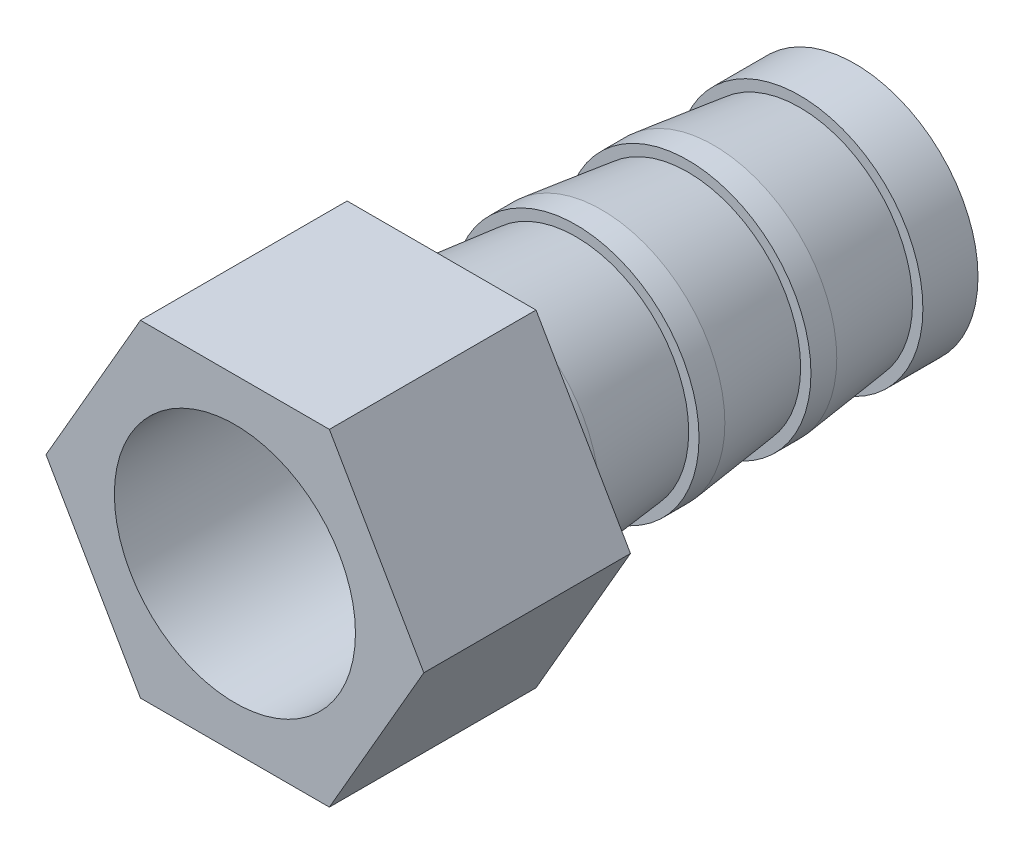
ISO-10303-21;
HEADER;
FILE_DESCRIPTION(('STEP AP214'),'2;1');
FILE_NAME('part.step','',(''),(''),'','','');
FILE_SCHEMA(('AUTOMOTIVE_DESIGN { 1 0 10303 214 1 1 1 1 }'));
ENDSEC;
DATA;
#1=APPLICATION_CONTEXT('core data for automotive mechanical design processes');
#2=APPLICATION_PROTOCOL_DEFINITION('international standard','automotive_design',2000,#1);
#3=PRODUCT_CONTEXT('',#1,'mechanical');
#4=PRODUCT('Part','Part','',(#3));
#5=PRODUCT_RELATED_PRODUCT_CATEGORY('part','',(#4));
#6=PRODUCT_DEFINITION_FORMATION('','',#4);
#7=PRODUCT_DEFINITION_CONTEXT('part definition',#1,'design');
#8=PRODUCT_DEFINITION('design','',#6,#7);
#9=PRODUCT_DEFINITION_SHAPE('','',#8);
#10=(LENGTH_UNIT() NAMED_UNIT(*) SI_UNIT(.MILLI.,.METRE.));
#11=(NAMED_UNIT(*) PLANE_ANGLE_UNIT() SI_UNIT($,.RADIAN.));
#12=(NAMED_UNIT(*) SI_UNIT($,.STERADIAN.) SOLID_ANGLE_UNIT());
#13=UNCERTAINTY_MEASURE_WITH_UNIT(LENGTH_MEASURE(1.E-05),#10,'distance_accuracy_value','');
#14=(GEOMETRIC_REPRESENTATION_CONTEXT(3) GLOBAL_UNCERTAINTY_ASSIGNED_CONTEXT((#13)) GLOBAL_UNIT_ASSIGNED_CONTEXT((#10,
#11,#12)) REPRESENTATION_CONTEXT('',''));
#15=CARTESIAN_POINT('',(0.,0.,0.));
#16=DIRECTION('',(0.,0.,1.));
#17=DIRECTION('',(1.,0.,0.));
#18=AXIS2_PLACEMENT_3D('',#15,#16,#17);
#19=CARTESIAN_POINT('',(0.,0.,12.));
#20=DIRECTION('',(0.,0.,1.));
#21=DIRECTION('',(1.,0.,0.));
#22=AXIS2_PLACEMENT_3D('',#19,#20,#21);
#23=PLANE('',#22);
#24=DIRECTION('',(-0.5,0.866025403784438,0.));
#25=VECTOR('',#24,1.);
#26=CARTESIAN_POINT('',(10.9696551146029,0.,12.));
#27=LINE('',#26,#25);
#28=CARTESIAN_POINT('',(10.9696551146029,0.,12.));
#29=VERTEX_POINT('',#28);
#30=CARTESIAN_POINT('',(5.48482755730144,9.5,12.));
#31=VERTEX_POINT('',#30);
#32=EDGE_CURVE('E133',#29,#31,#27,.T.);
#33=ORIENTED_EDGE('',*,*,#32,.T.);
#34=DIRECTION('',(-1.,0.,0.));
#35=VECTOR('',#34,1.);
#36=CARTESIAN_POINT('',(5.48482755730144,9.5,12.));
#37=LINE('',#36,#35);
#38=CARTESIAN_POINT('',(-5.48482755730145,9.5,12.));
#39=VERTEX_POINT('',#38);
#40=EDGE_CURVE('E91',#31,#39,#37,.T.);
#41=ORIENTED_EDGE('',*,*,#40,.T.);
#42=DIRECTION('',(-0.5,-0.866025403784439,0.));
#43=VECTOR('',#42,1.);
#44=CARTESIAN_POINT('',(-5.48482755730145,9.5,12.));
#45=LINE('',#44,#43);
#46=CARTESIAN_POINT('',(-10.9696551146029,0.,12.));
#47=VERTEX_POINT('',#46);
#48=EDGE_CURVE('E104',#39,#47,#45,.T.);
#49=ORIENTED_EDGE('',*,*,#48,.T.);
#50=DIRECTION('',(0.5,-0.866025403784438,0.));
#51=VECTOR('',#50,1.);
#52=CARTESIAN_POINT('',(-10.9696551146029,0.,12.));
#53=LINE('',#52,#51);
#54=CARTESIAN_POINT('',(-5.48482755730144,-9.5,12.));
#55=VERTEX_POINT('',#54);
#56=EDGE_CURVE('E98',#47,#55,#53,.T.);
#57=ORIENTED_EDGE('',*,*,#56,.T.);
#58=DIRECTION('',(1.,0.,0.));
#59=VECTOR('',#58,1.);
#60=CARTESIAN_POINT('',(-5.48482755730144,-9.5,12.));
#61=LINE('',#60,#59);
#62=CARTESIAN_POINT('',(5.48482755730144,-9.5,12.));
#63=VERTEX_POINT('',#62);
#64=EDGE_CURVE('E102',#55,#63,#61,.T.);
#65=ORIENTED_EDGE('',*,*,#64,.T.);
#66=DIRECTION('',(0.5,0.866025403784439,0.));
#67=VECTOR('',#66,1.);
#68=CARTESIAN_POINT('',(5.48482755730144,-9.5,12.));
#69=LINE('',#68,#67);
#70=EDGE_CURVE('E53',#63,#29,#69,.T.);
#71=ORIENTED_EDGE('',*,*,#70,.T.);
#72=EDGE_LOOP('',(#33,#41,#49,#57,#65,#71));
#73=FACE_BOUND('',#72,.T.);
#74=CARTESIAN_POINT('',(0.,0.,12.));
#75=DIRECTION('',(0.,0.,1.));
#76=DIRECTION('',(1.,0.,0.));
#77=AXIS2_PLACEMENT_3D('',#74,#75,#76);
#78=CIRCLE('',#77,7.);
#79=CARTESIAN_POINT('',(7.,0.,12.));
#80=VERTEX_POINT('',#79);
#81=EDGE_CURVE('E126',#80,#80,#78,.T.);
#82=ORIENTED_EDGE('',*,*,#81,.F.);
#83=EDGE_LOOP('',(#82));
#84=FACE_BOUND('',#83,.T.);
#85=ADVANCED_FACE('F36',(#73,#84),#23,.T.);
#86=CARTESIAN_POINT('',(0.,0.,0.));
#87=DIRECTION('',(0.,0.,1.));
#88=DIRECTION('',(1.,0.,0.));
#89=AXIS2_PLACEMENT_3D('',#86,#87,#88);
#90=PLANE('',#89);
#91=CARTESIAN_POINT('',(0.,0.,0.));
#92=DIRECTION('',(0.,0.,1.));
#93=DIRECTION('',(1.,0.,0.));
#94=AXIS2_PLACEMENT_3D('',#91,#92,#93);
#95=CIRCLE('',#94,7.15);
#96=CARTESIAN_POINT('',(7.15,0.,0.));
#97=VERTEX_POINT('',#96);
#98=EDGE_CURVE('E11',#97,#97,#95,.F.);
#99=ORIENTED_EDGE('',*,*,#98,.F.);
#100=EDGE_LOOP('',(#99));
#101=FACE_BOUND('',#100,.T.);
#102=DIRECTION('',(-0.5,0.866025403784438,0.));
#103=VECTOR('',#102,1.);
#104=CARTESIAN_POINT('',(10.9696551146029,0.,0.));
#105=LINE('',#104,#103);
#106=CARTESIAN_POINT('',(10.9696551146029,0.,0.));
#107=VERTEX_POINT('',#106);
#108=CARTESIAN_POINT('',(5.48482755730144,9.5,0.));
#109=VERTEX_POINT('',#108);
#110=EDGE_CURVE('E122',#107,#109,#105,.T.);
#111=ORIENTED_EDGE('',*,*,#110,.F.);
#112=DIRECTION('',(0.5,0.866025403784439,0.));
#113=VECTOR('',#112,1.);
#114=CARTESIAN_POINT('',(5.48482755730144,-9.5,0.));
#115=LINE('',#114,#113);
#116=CARTESIAN_POINT('',(5.48482755730144,-9.5,0.));
#117=VERTEX_POINT('',#116);
#118=EDGE_CURVE('E82',#117,#107,#115,.T.);
#119=ORIENTED_EDGE('',*,*,#118,.F.);
#120=DIRECTION('',(1.,0.,0.));
#121=VECTOR('',#120,1.);
#122=CARTESIAN_POINT('',(-5.48482755730144,-9.5,0.));
#123=LINE('',#122,#121);
#124=CARTESIAN_POINT('',(-5.48482755730144,-9.5,0.));
#125=VERTEX_POINT('',#124);
#126=EDGE_CURVE('E76',#125,#117,#123,.T.);
#127=ORIENTED_EDGE('',*,*,#126,.F.);
#128=DIRECTION('',(0.5,-0.866025403784438,0.));
#129=VECTOR('',#128,1.);
#130=CARTESIAN_POINT('',(-10.9696551146029,0.,0.));
#131=LINE('',#130,#129);
#132=CARTESIAN_POINT('',(-10.9696551146029,0.,0.));
#133=VERTEX_POINT('',#132);
#134=EDGE_CURVE('E112',#133,#125,#131,.T.);
#135=ORIENTED_EDGE('',*,*,#134,.F.);
#136=DIRECTION('',(-0.5,-0.866025403784439,0.));
#137=VECTOR('',#136,1.);
#138=CARTESIAN_POINT('',(-5.48482755730145,9.5,0.));
#139=LINE('',#138,#137);
#140=CARTESIAN_POINT('',(-5.48482755730145,9.5,0.));
#141=VERTEX_POINT('',#140);
#142=EDGE_CURVE('E128',#141,#133,#139,.T.);
#143=ORIENTED_EDGE('',*,*,#142,.F.);
#144=DIRECTION('',(-1.,0.,0.));
#145=VECTOR('',#144,1.);
#146=CARTESIAN_POINT('',(5.48482755730144,9.5,0.));
#147=LINE('',#146,#145);
#148=EDGE_CURVE('E125',#109,#141,#147,.T.);
#149=ORIENTED_EDGE('',*,*,#148,.F.);
#150=EDGE_LOOP('',(#111,#119,#127,#135,#143,#149));
#151=FACE_BOUND('',#150,.T.);
#152=ADVANCED_FACE('F145',(#101,#151),#90,.F.);
#153=CARTESIAN_POINT('',(10.9696551146029,0.,12.));
#154=DIRECTION('',(-0.866025403784439,-0.5,0.));
#155=DIRECTION('',(0.5,-0.866025403784439,0.));
#156=AXIS2_PLACEMENT_3D('',#153,#154,#155);
#157=PLANE('',#156);
#158=ORIENTED_EDGE('',*,*,#110,.T.);
#159=DIRECTION('',(0.,0.,-1.));
#160=VECTOR('',#159,1.);
#161=CARTESIAN_POINT('',(5.48482755730144,9.5,12.));
#162=LINE('',#161,#160);
#163=EDGE_CURVE('E45',#31,#109,#162,.T.);
#164=ORIENTED_EDGE('',*,*,#163,.F.);
#165=ORIENTED_EDGE('',*,*,#32,.F.);
#166=DIRECTION('',(0.,0.,-1.));
#167=VECTOR('',#166,1.);
#168=CARTESIAN_POINT('',(10.9696551146029,0.,12.));
#169=LINE('',#168,#167);
#170=EDGE_CURVE('E118',#29,#107,#169,.T.);
#171=ORIENTED_EDGE('',*,*,#170,.T.);
#172=EDGE_LOOP('',(#158,#164,#165,#171));
#173=FACE_BOUND('',#172,.T.);
#174=ADVANCED_FACE('F38',(#173),#157,.F.);
#175=CARTESIAN_POINT('',(5.48482755730144,9.5,12.));
#176=DIRECTION('',(0.,-1.,0.));
#177=DIRECTION('',(0.,0.,-1.));
#178=AXIS2_PLACEMENT_3D('',#175,#176,#177);
#179=PLANE('',#178);
#180=ORIENTED_EDGE('',*,*,#148,.T.);
#181=DIRECTION('',(0.,0.,-1.));
#182=VECTOR('',#181,1.);
#183=CARTESIAN_POINT('',(-5.48482755730145,9.5,12.));
#184=LINE('',#183,#182);
#185=EDGE_CURVE('E137',#39,#141,#184,.T.);
#186=ORIENTED_EDGE('',*,*,#185,.F.);
#187=ORIENTED_EDGE('',*,*,#40,.F.);
#188=ORIENTED_EDGE('',*,*,#163,.T.);
#189=EDGE_LOOP('',(#180,#186,#187,#188));
#190=FACE_BOUND('',#189,.T.);
#191=ADVANCED_FACE('F140',(#190),#179,.F.);
#192=CARTESIAN_POINT('',(-5.48482755730145,9.5,12.));
#193=DIRECTION('',(0.866025403784438,-0.5,0.));
#194=DIRECTION('',(0.5,0.866025403784439,0.));
#195=AXIS2_PLACEMENT_3D('',#192,#193,#194);
#196=PLANE('',#195);
#197=ORIENTED_EDGE('',*,*,#142,.T.);
#198=DIRECTION('',(0.,0.,-1.));
#199=VECTOR('',#198,1.);
#200=CARTESIAN_POINT('',(-10.9696551146029,0.,12.));
#201=LINE('',#200,#199);
#202=EDGE_CURVE('E113',#47,#133,#201,.T.);
#203=ORIENTED_EDGE('',*,*,#202,.F.);
#204=ORIENTED_EDGE('',*,*,#48,.F.);
#205=ORIENTED_EDGE('',*,*,#185,.T.);
#206=EDGE_LOOP('',(#197,#203,#204,#205));
#207=FACE_BOUND('',#206,.T.);
#208=ADVANCED_FACE('F148',(#207),#196,.F.);
#209=CARTESIAN_POINT('',(-10.9696551146029,0.,12.));
#210=DIRECTION('',(0.866025403784439,0.5,0.));
#211=DIRECTION('',(-0.5,0.866025403784439,0.));
#212=AXIS2_PLACEMENT_3D('',#209,#210,#211);
#213=PLANE('',#212);
#214=ORIENTED_EDGE('',*,*,#134,.T.);
#215=DIRECTION('',(0.,0.,-1.));
#216=VECTOR('',#215,1.);
#217=CARTESIAN_POINT('',(-5.48482755730144,-9.5,12.));
#218=LINE('',#217,#216);
#219=EDGE_CURVE('E109',#55,#125,#218,.T.);
#220=ORIENTED_EDGE('',*,*,#219,.F.);
#221=ORIENTED_EDGE('',*,*,#56,.F.);
#222=ORIENTED_EDGE('',*,*,#202,.T.);
#223=EDGE_LOOP('',(#214,#220,#221,#222));
#224=FACE_BOUND('',#223,.T.);
#225=ADVANCED_FACE('F110',(#224),#213,.F.);
#226=CARTESIAN_POINT('',(-5.48482755730144,-9.5,12.));
#227=DIRECTION('',(0.,1.,0.));
#228=DIRECTION('',(0.,0.,1.));
#229=AXIS2_PLACEMENT_3D('',#226,#227,#228);
#230=PLANE('',#229);
#231=ORIENTED_EDGE('',*,*,#126,.T.);
#232=DIRECTION('',(0.,0.,-1.));
#233=VECTOR('',#232,1.);
#234=CARTESIAN_POINT('',(5.48482755730144,-9.5,12.));
#235=LINE('',#234,#233);
#236=EDGE_CURVE('E114',#63,#117,#235,.T.);
#237=ORIENTED_EDGE('',*,*,#236,.F.);
#238=ORIENTED_EDGE('',*,*,#64,.F.);
#239=ORIENTED_EDGE('',*,*,#219,.T.);
#240=EDGE_LOOP('',(#231,#237,#238,#239));
#241=FACE_BOUND('',#240,.T.);
#242=ADVANCED_FACE('F116',(#241),#230,.F.);
#243=CARTESIAN_POINT('',(5.48482755730144,-9.5,12.));
#244=DIRECTION('',(-0.866025403784438,0.5,0.));
#245=DIRECTION('',(-0.5,-0.866025403784439,0.));
#246=AXIS2_PLACEMENT_3D('',#243,#244,#245);
#247=PLANE('',#246);
#248=ORIENTED_EDGE('',*,*,#118,.T.);
#249=ORIENTED_EDGE('',*,*,#170,.F.);
#250=ORIENTED_EDGE('',*,*,#70,.F.);
#251=ORIENTED_EDGE('',*,*,#236,.T.);
#252=EDGE_LOOP('',(#248,#249,#250,#251));
#253=FACE_BOUND('',#252,.T.);
#254=ADVANCED_FACE('F205',(#253),#247,.F.);
#255=CARTESIAN_POINT('',(0.,0.,12.));
#256=DIRECTION('',(0.,0.,-1.));
#257=DIRECTION('',(-1.,0.,0.));
#258=AXIS2_PLACEMENT_3D('',#255,#256,#257);
#259=CYLINDRICAL_SURFACE('',#258,7.);
#260=ORIENTED_EDGE('',*,*,#81,.T.);
#261=EDGE_LOOP('',(#260));
#262=FACE_BOUND('',#261,.T.);
#263=CARTESIAN_POINT('',(0.,0.,0.));
#264=DIRECTION('',(0.,0.,1.));
#265=DIRECTION('',(1.,0.,0.));
#266=AXIS2_PLACEMENT_3D('',#263,#264,#265);
#267=CIRCLE('',#266,7.);
#268=CARTESIAN_POINT('',(7.,0.,0.));
#269=VERTEX_POINT('',#268);
#270=EDGE_CURVE('E152',#269,#269,#267,.T.);
#271=ORIENTED_EDGE('',*,*,#270,.F.);
#272=EDGE_LOOP('',(#271));
#273=FACE_BOUND('',#272,.T.);
#274=ADVANCED_FACE('F200',(#262,#273),#259,.F.);
#275=CARTESIAN_POINT('',(-7.15,0.,0.));
#276=DIRECTION('',(0.,0.,-1.));
#277=DIRECTION('',(-1.,0.,0.));
#278=AXIS2_PLACEMENT_3D('',#275,#276,#277);
#279=PLANE('',#278);
#280=CARTESIAN_POINT('',(0.,0.,0.));
#281=DIRECTION('',(0.,0.,1.));
#282=DIRECTION('',(1.,0.,0.));
#283=AXIS2_PLACEMENT_3D('',#280,#281,#282);
#284=CIRCLE('',#283,6.);
#285=CARTESIAN_POINT('',(6.,0.,0.));
#286=VERTEX_POINT('',#285);
#287=EDGE_CURVE('E190',#286,#286,#284,.T.);
#288=ORIENTED_EDGE('',*,*,#287,.F.);
#289=EDGE_LOOP('',(#288));
#290=FACE_BOUND('',#289,.T.);
#291=ORIENTED_EDGE('',*,*,#270,.T.);
#292=EDGE_LOOP('',(#291));
#293=FACE_BOUND('',#292,.T.);
#294=ADVANCED_FACE('F196',(#290,#293),#279,.F.);
#295=CARTESIAN_POINT('',(0.,0.,0.));
#296=DIRECTION('',(0.,0.,1.));
#297=DIRECTION('',(1.,0.,0.));
#298=AXIS2_PLACEMENT_3D('',#295,#296,#297);
#299=CYLINDRICAL_SURFACE('',#298,7.15);
#300=ORIENTED_EDGE('',*,*,#98,.T.);
#301=EDGE_LOOP('',(#300));
#302=FACE_BOUND('',#301,.T.);
#303=CARTESIAN_POINT('',(0.,0.,-2.));
#304=DIRECTION('',(0.,0.,1.));
#305=DIRECTION('',(1.,0.,0.));
#306=AXIS2_PLACEMENT_3D('',#303,#304,#305);
#307=CIRCLE('',#306,7.15);
#308=CARTESIAN_POINT('',(7.15,0.,-2.));
#309=VERTEX_POINT('',#308);
#310=EDGE_CURVE('E155',#309,#309,#307,.T.);
#311=ORIENTED_EDGE('',*,*,#310,.T.);
#312=EDGE_LOOP('',(#311));
#313=FACE_BOUND('',#312,.T.);
#314=ADVANCED_FACE('F199',(#302,#313),#299,.T.);
#315=CARTESIAN_POINT('',(0.,0.,-7.8));
#316=DIRECTION('',(0.,0.,1.));
#317=DIRECTION('',(1.,0.,0.));
#318=AXIS2_PLACEMENT_3D('',#315,#316,#317);
#319=CONICAL_SURFACE('',#318,6.55,0.1030816085227);
#320=ORIENTED_EDGE('',*,*,#310,.F.);
#321=EDGE_LOOP('',(#320));
#322=FACE_BOUND('',#321,.T.);
#323=CARTESIAN_POINT('',(0.,0.,-7.8));
#324=DIRECTION('',(0.,0.,1.));
#325=DIRECTION('',(1.,0.,0.));
#326=AXIS2_PLACEMENT_3D('',#323,#324,#325);
#327=CIRCLE('',#326,6.55);
#328=CARTESIAN_POINT('',(6.55,0.,-7.8));
#329=VERTEX_POINT('',#328);
#330=EDGE_CURVE('E160',#329,#329,#327,.T.);
#331=ORIENTED_EDGE('',*,*,#330,.T.);
#332=EDGE_LOOP('',(#331));
#333=FACE_BOUND('',#332,.T.);
#334=ADVANCED_FACE('F302',(#322,#333),#319,.T.);
#335=CARTESIAN_POINT('',(-6.55,0.,-7.8));
#336=DIRECTION('',(0.,0.,-1.));
#337=DIRECTION('',(-1.,0.,0.));
#338=AXIS2_PLACEMENT_3D('',#335,#336,#337);
#339=PLANE('',#338);
#340=ORIENTED_EDGE('',*,*,#330,.F.);
#341=EDGE_LOOP('',(#340));
#342=FACE_BOUND('',#341,.T.);
#343=CARTESIAN_POINT('',(0.,0.,-7.8));
#344=DIRECTION('',(0.,0.,1.));
#345=DIRECTION('',(1.,0.,0.));
#346=AXIS2_PLACEMENT_3D('',#343,#344,#345);
#347=CIRCLE('',#346,7.15);
#348=CARTESIAN_POINT('',(7.15,0.,-7.8));
#349=VERTEX_POINT('',#348);
#350=EDGE_CURVE('E163',#349,#349,#347,.T.);
#351=ORIENTED_EDGE('',*,*,#350,.T.);
#352=EDGE_LOOP('',(#351));
#353=FACE_BOUND('',#352,.T.);
#354=ADVANCED_FACE('F312',(#342,#353),#339,.F.);
#355=CARTESIAN_POINT('',(0.,0.,0.));
#356=DIRECTION('',(0.,0.,1.));
#357=DIRECTION('',(1.,0.,0.));
#358=AXIS2_PLACEMENT_3D('',#355,#356,#357);
#359=CYLINDRICAL_SURFACE('',#358,7.15);
#360=ORIENTED_EDGE('',*,*,#350,.F.);
#361=EDGE_LOOP('',(#360));
#362=FACE_BOUND('',#361,.T.);
#363=CARTESIAN_POINT('',(0.,0.,-9.3));
#364=DIRECTION('',(0.,0.,1.));
#365=DIRECTION('',(1.,0.,0.));
#366=AXIS2_PLACEMENT_3D('',#363,#364,#365);
#367=CIRCLE('',#366,7.15);
#368=CARTESIAN_POINT('',(7.15,0.,-9.3));
#369=VERTEX_POINT('',#368);
#370=EDGE_CURVE('E166',#369,#369,#367,.T.);
#371=ORIENTED_EDGE('',*,*,#370,.T.);
#372=EDGE_LOOP('',(#371));
#373=FACE_BOUND('',#372,.T.);
#374=ADVANCED_FACE('F322',(#362,#373),#359,.T.);
#375=CARTESIAN_POINT('',(0.,0.,-14.3));
#376=DIRECTION('',(0.,0.,1.));
#377=DIRECTION('',(1.,0.,0.));
#378=AXIS2_PLACEMENT_3D('',#375,#376,#377);
#379=CONICAL_SURFACE('',#378,6.55,0.119428926018339);
#380=ORIENTED_EDGE('',*,*,#370,.F.);
#381=EDGE_LOOP('',(#380));
#382=FACE_BOUND('',#381,.T.);
#383=CARTESIAN_POINT('',(0.,0.,-14.3));
#384=DIRECTION('',(0.,0.,1.));
#385=DIRECTION('',(1.,0.,0.));
#386=AXIS2_PLACEMENT_3D('',#383,#384,#385);
#387=CIRCLE('',#386,6.55);
#388=CARTESIAN_POINT('',(6.55,0.,-14.3));
#389=VERTEX_POINT('',#388);
#390=EDGE_CURVE('E169',#389,#389,#387,.T.);
#391=ORIENTED_EDGE('',*,*,#390,.T.);
#392=EDGE_LOOP('',(#391));
#393=FACE_BOUND('',#392,.T.);
#394=ADVANCED_FACE('F332',(#382,#393),#379,.T.);
#395=CARTESIAN_POINT('',(-6.55,0.,-14.3));
#396=DIRECTION('',(0.,0.,-1.));
#397=DIRECTION('',(-1.,0.,0.));
#398=AXIS2_PLACEMENT_3D('',#395,#396,#397);
#399=PLANE('',#398);
#400=ORIENTED_EDGE('',*,*,#390,.F.);
#401=EDGE_LOOP('',(#400));
#402=FACE_BOUND('',#401,.T.);
#403=CARTESIAN_POINT('',(0.,0.,-14.3));
#404=DIRECTION('',(0.,0.,1.));
#405=DIRECTION('',(1.,0.,0.));
#406=AXIS2_PLACEMENT_3D('',#403,#404,#405);
#407=CIRCLE('',#406,7.15);
#408=CARTESIAN_POINT('',(7.15,0.,-14.3));
#409=VERTEX_POINT('',#408);
#410=EDGE_CURVE('E172',#409,#409,#407,.T.);
#411=ORIENTED_EDGE('',*,*,#410,.T.);
#412=EDGE_LOOP('',(#411));
#413=FACE_BOUND('',#412,.T.);
#414=ADVANCED_FACE('F342',(#402,#413),#399,.F.);
#415=CARTESIAN_POINT('',(0.,0.,0.));
#416=DIRECTION('',(0.,0.,1.));
#417=DIRECTION('',(1.,0.,0.));
#418=AXIS2_PLACEMENT_3D('',#415,#416,#417);
#419=CYLINDRICAL_SURFACE('',#418,7.15);
#420=ORIENTED_EDGE('',*,*,#410,.F.);
#421=EDGE_LOOP('',(#420));
#422=FACE_BOUND('',#421,.T.);
#423=CARTESIAN_POINT('',(0.,0.,-15.8));
#424=DIRECTION('',(0.,0.,1.));
#425=DIRECTION('',(1.,0.,0.));
#426=AXIS2_PLACEMENT_3D('',#423,#424,#425);
#427=CIRCLE('',#426,7.15);
#428=CARTESIAN_POINT('',(7.15,0.,-15.8));
#429=VERTEX_POINT('',#428);
#430=EDGE_CURVE('E175',#429,#429,#427,.T.);
#431=ORIENTED_EDGE('',*,*,#430,.T.);
#432=EDGE_LOOP('',(#431));
#433=FACE_BOUND('',#432,.T.);
#434=ADVANCED_FACE('F352',(#422,#433),#419,.T.);
#435=CARTESIAN_POINT('',(0.,0.,-20.8));
#436=DIRECTION('',(0.,0.,1.));
#437=DIRECTION('',(1.,0.,0.));
#438=AXIS2_PLACEMENT_3D('',#435,#436,#437);
#439=CONICAL_SURFACE('',#438,6.55,0.119428926018338);
#440=ORIENTED_EDGE('',*,*,#430,.F.);
#441=EDGE_LOOP('',(#440));
#442=FACE_BOUND('',#441,.T.);
#443=CARTESIAN_POINT('',(0.,0.,-20.8));
#444=DIRECTION('',(0.,0.,1.));
#445=DIRECTION('',(1.,0.,0.));
#446=AXIS2_PLACEMENT_3D('',#443,#444,#445);
#447=CIRCLE('',#446,6.55);
#448=CARTESIAN_POINT('',(6.55,0.,-20.8));
#449=VERTEX_POINT('',#448);
#450=EDGE_CURVE('E178',#449,#449,#447,.T.);
#451=ORIENTED_EDGE('',*,*,#450,.T.);
#452=EDGE_LOOP('',(#451));
#453=FACE_BOUND('',#452,.T.);
#454=ADVANCED_FACE('F362',(#442,#453),#439,.T.);
#455=CARTESIAN_POINT('',(-6.55,0.,-20.8));
#456=DIRECTION('',(0.,0.,-1.));
#457=DIRECTION('',(-1.,0.,0.));
#458=AXIS2_PLACEMENT_3D('',#455,#456,#457);
#459=PLANE('',#458);
#460=ORIENTED_EDGE('',*,*,#450,.F.);
#461=EDGE_LOOP('',(#460));
#462=FACE_BOUND('',#461,.T.);
#463=CARTESIAN_POINT('',(0.,0.,-20.8));
#464=DIRECTION('',(0.,0.,1.));
#465=DIRECTION('',(1.,0.,0.));
#466=AXIS2_PLACEMENT_3D('',#463,#464,#465);
#467=CIRCLE('',#466,7.15);
#468=CARTESIAN_POINT('',(7.15,0.,-20.8));
#469=VERTEX_POINT('',#468);
#470=EDGE_CURVE('E181',#469,#469,#467,.T.);
#471=ORIENTED_EDGE('',*,*,#470,.T.);
#472=EDGE_LOOP('',(#471));
#473=FACE_BOUND('',#472,.T.);
#474=ADVANCED_FACE('F372',(#462,#473),#459,.F.);
#475=CARTESIAN_POINT('',(0.,0.,0.));
#476=DIRECTION('',(0.,0.,1.));
#477=DIRECTION('',(1.,0.,0.));
#478=AXIS2_PLACEMENT_3D('',#475,#476,#477);
#479=CYLINDRICAL_SURFACE('',#478,7.15);
#480=ORIENTED_EDGE('',*,*,#470,.F.);
#481=EDGE_LOOP('',(#480));
#482=FACE_BOUND('',#481,.T.);
#483=CARTESIAN_POINT('',(0.,0.,-24.));
#484=DIRECTION('',(0.,0.,1.));
#485=DIRECTION('',(1.,0.,0.));
#486=AXIS2_PLACEMENT_3D('',#483,#484,#485);
#487=CIRCLE('',#486,7.15);
#488=CARTESIAN_POINT('',(7.15,0.,-24.));
#489=VERTEX_POINT('',#488);
#490=EDGE_CURVE('E184',#489,#489,#487,.T.);
#491=ORIENTED_EDGE('',*,*,#490,.T.);
#492=EDGE_LOOP('',(#491));
#493=FACE_BOUND('',#492,.T.);
#494=ADVANCED_FACE('F382',(#482,#493),#479,.T.);
#495=CARTESIAN_POINT('',(-7.15,0.,-24.));
#496=DIRECTION('',(0.,0.,1.));
#497=DIRECTION('',(1.,0.,0.));
#498=AXIS2_PLACEMENT_3D('',#495,#496,#497);
#499=PLANE('',#498);
#500=ORIENTED_EDGE('',*,*,#490,.F.);
#501=EDGE_LOOP('',(#500));
#502=FACE_BOUND('',#501,.T.);
#503=CARTESIAN_POINT('',(0.,0.,-24.));
#504=DIRECTION('',(0.,0.,1.));
#505=DIRECTION('',(1.,0.,0.));
#506=AXIS2_PLACEMENT_3D('',#503,#504,#505);
#507=CIRCLE('',#506,6.);
#508=CARTESIAN_POINT('',(6.,0.,-24.));
#509=VERTEX_POINT('',#508);
#510=EDGE_CURVE('E187',#509,#509,#507,.T.);
#511=ORIENTED_EDGE('',*,*,#510,.T.);
#512=EDGE_LOOP('',(#511));
#513=FACE_BOUND('',#512,.T.);
#514=ADVANCED_FACE('F392',(#502,#513),#499,.F.);
#515=CARTESIAN_POINT('',(0.,0.,0.));
#516=DIRECTION('',(0.,0.,1.));
#517=DIRECTION('',(1.,0.,0.));
#518=AXIS2_PLACEMENT_3D('',#515,#516,#517);
#519=CYLINDRICAL_SURFACE('',#518,6.);
#520=ORIENTED_EDGE('',*,*,#510,.F.);
#521=EDGE_LOOP('',(#520));
#522=FACE_BOUND('',#521,.T.);
#523=ORIENTED_EDGE('',*,*,#287,.T.);
#524=EDGE_LOOP('',(#523));
#525=FACE_BOUND('',#524,.T.);
#526=ADVANCED_FACE('F194',(#522,#525),#519,.F.);
#527=CLOSED_SHELL('',(#85,#152,#174,#191,#208,#225,#242,#254,#274,#294,#314,#334,#354,#374,#394,
#414,#434,#454,#474,#494,#514,#526));
#528=MANIFOLD_SOLID_BREP('B2',#527);
#529=ADVANCED_BREP_SHAPE_REPRESENTATION('',(#18,#528),#14);
#530=SHAPE_DEFINITION_REPRESENTATION(#9,#529);
ENDSEC;
END-ISO-10303-21;
